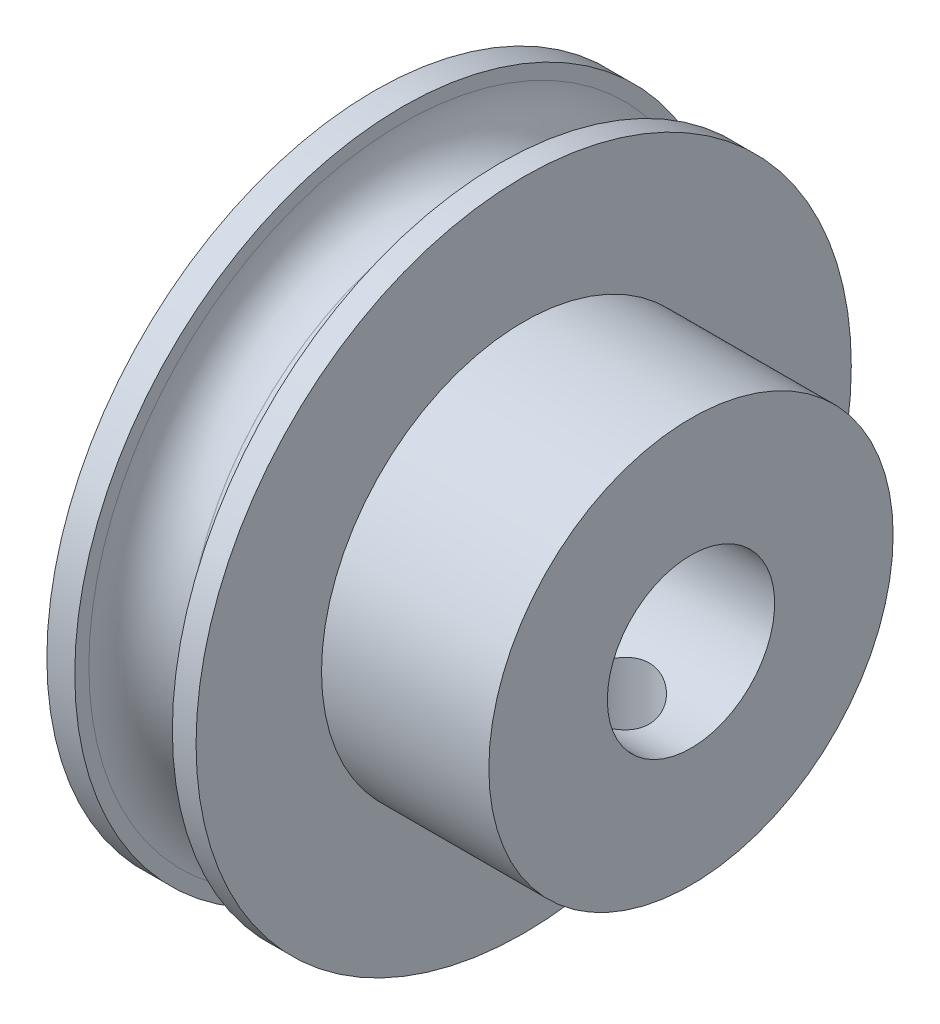
ISO-10303-21;
HEADER;
FILE_DESCRIPTION(('STEP AP214'),'2;1');
FILE_NAME('part.step','',(''),(''),'','','');
FILE_SCHEMA(('AUTOMOTIVE_DESIGN { 1 0 10303 214 1 1 1 1 }'));
ENDSEC;
DATA;
#1=APPLICATION_CONTEXT('core data for automotive mechanical design processes');
#2=APPLICATION_PROTOCOL_DEFINITION('international standard','automotive_design',2000,#1);
#3=PRODUCT_CONTEXT('',#1,'mechanical');
#4=PRODUCT('Part','Part','',(#3));
#5=PRODUCT_RELATED_PRODUCT_CATEGORY('part','',(#4));
#6=PRODUCT_DEFINITION_FORMATION('','',#4);
#7=PRODUCT_DEFINITION_CONTEXT('part definition',#1,'design');
#8=PRODUCT_DEFINITION('design','',#6,#7);
#9=PRODUCT_DEFINITION_SHAPE('','',#8);
#10=(LENGTH_UNIT() NAMED_UNIT(*) SI_UNIT(.MILLI.,.METRE.));
#11=(NAMED_UNIT(*) PLANE_ANGLE_UNIT() SI_UNIT($,.RADIAN.));
#12=(NAMED_UNIT(*) SI_UNIT($,.STERADIAN.) SOLID_ANGLE_UNIT());
#13=UNCERTAINTY_MEASURE_WITH_UNIT(LENGTH_MEASURE(1.E-05),#10,'distance_accuracy_value','');
#14=(GEOMETRIC_REPRESENTATION_CONTEXT(3) GLOBAL_UNCERTAINTY_ASSIGNED_CONTEXT((#13)) GLOBAL_UNIT_ASSIGNED_CONTEXT((#10,
#11,#12)) REPRESENTATION_CONTEXT('',''));
#15=CARTESIAN_POINT('',(0.,0.,0.));
#16=DIRECTION('',(0.,0.,1.));
#17=DIRECTION('',(1.,0.,0.));
#18=AXIS2_PLACEMENT_3D('',#15,#16,#17);
#19=CARTESIAN_POINT('',(0.,23.5,0.));
#20=DIRECTION('',(1.,0.,0.));
#21=DIRECTION('',(0.,0.,-1.));
#22=AXIS2_PLACEMENT_3D('',#19,#20,#21);
#23=PLANE('',#22);
#24=CARTESIAN_POINT('',(0.,0.,0.));
#25=DIRECTION('',(-1.,0.,0.));
#26=DIRECTION('',(0.,0.,1.));
#27=AXIS2_PLACEMENT_3D('',#24,#25,#26);
#28=CIRCLE('',#27,6.);
#29=CARTESIAN_POINT('',(0.,0.,6.));
#30=VERTEX_POINT('',#29);
#31=EDGE_CURVE('E88',#30,#30,#28,.T.);
#32=ORIENTED_EDGE('',*,*,#31,.F.);
#33=EDGE_LOOP('',(#32));
#34=FACE_BOUND('',#33,.T.);
#35=CARTESIAN_POINT('',(0.,0.,0.));
#36=DIRECTION('',(-1.,0.,0.));
#37=DIRECTION('',(0.,0.,1.));
#38=AXIS2_PLACEMENT_3D('',#35,#36,#37);
#39=CIRCLE('',#38,23.5);
#40=CARTESIAN_POINT('',(0.,0.,23.5));
#41=VERTEX_POINT('',#40);
#42=EDGE_CURVE('E12',#41,#41,#39,.T.);
#43=ORIENTED_EDGE('',*,*,#42,.T.);
#44=EDGE_LOOP('',(#43));
#45=FACE_BOUND('',#44,.T.);
#46=ADVANCED_FACE('F48',(#34,#45),#23,.F.);
#47=CARTESIAN_POINT('',(0.,0.,0.));
#48=DIRECTION('',(-1.,0.,0.));
#49=DIRECTION('',(0.,0.,1.));
#50=AXIS2_PLACEMENT_3D('',#47,#48,#49);
#51=CYLINDRICAL_SURFACE('',#50,23.5);
#52=ORIENTED_EDGE('',*,*,#42,.F.);
#53=EDGE_LOOP('',(#52));
#54=FACE_BOUND('',#53,.T.);
#55=CARTESIAN_POINT('',(2.,0.,0.));
#56=DIRECTION('',(-1.,0.,0.));
#57=DIRECTION('',(0.,0.,1.));
#58=AXIS2_PLACEMENT_3D('',#55,#56,#57);
#59=CIRCLE('',#58,23.5);
#60=CARTESIAN_POINT('',(2.,0.,23.5));
#61=VERTEX_POINT('',#60);
#62=EDGE_CURVE('E54',#61,#61,#59,.T.);
#63=ORIENTED_EDGE('',*,*,#62,.T.);
#64=EDGE_LOOP('',(#63));
#65=FACE_BOUND('',#64,.T.);
#66=ADVANCED_FACE('F148',(#54,#65),#51,.T.);
#67=CARTESIAN_POINT('',(2.,22.49,0.));
#68=DIRECTION('',(-1.,0.,0.));
#69=DIRECTION('',(0.,0.,1.));
#70=AXIS2_PLACEMENT_3D('',#67,#68,#69);
#71=PLANE('',#70);
#72=ORIENTED_EDGE('',*,*,#62,.F.);
#73=EDGE_LOOP('',(#72));
#74=FACE_BOUND('',#73,.T.);
#75=CARTESIAN_POINT('',(2.,0.,0.));
#76=DIRECTION('',(-1.,0.,0.));
#77=DIRECTION('',(0.,0.,1.));
#78=AXIS2_PLACEMENT_3D('',#75,#76,#77);
#79=CIRCLE('',#78,22.49);
#80=CARTESIAN_POINT('',(2.,0.,22.49));
#81=VERTEX_POINT('',#80);
#82=EDGE_CURVE('E58',#81,#81,#79,.T.);
#83=ORIENTED_EDGE('',*,*,#82,.T.);
#84=EDGE_LOOP('',(#83));
#85=FACE_BOUND('',#84,.T.);
#86=ADVANCED_FACE('F145',(#74,#85),#71,.F.);
#87=CARTESIAN_POINT('',(5.48999999999999,0.,0.));
#88=DIRECTION('',(-1.,0.,0.));
#89=DIRECTION('',(0.,0.,1.));
#90=AXIS2_PLACEMENT_3D('',#87,#88,#89);
#91=TOROIDAL_SURFACE('',#90,22.49,3.49);
#92=ORIENTED_EDGE('',*,*,#82,.F.);
#93=EDGE_LOOP('',(#92));
#94=FACE_BOUND('',#93,.T.);
#95=CARTESIAN_POINT('',(5.48999999999999,0.,0.));
#96=DIRECTION('',(-1.,0.,0.));
#97=DIRECTION('',(0.,0.,1.));
#98=AXIS2_PLACEMENT_3D('',#95,#96,#97);
#99=CIRCLE('',#98,19.);
#100=CARTESIAN_POINT('',(5.48999999999999,0.,19.));
#101=VERTEX_POINT('',#100);
#102=EDGE_CURVE('E62',#101,#101,#99,.T.);
#103=ORIENTED_EDGE('',*,*,#102,.T.);
#104=EDGE_LOOP('',(#103));
#105=FACE_BOUND('',#104,.T.);
#106=ADVANCED_FACE('F141',(#94,#105),#91,.F.);
#107=CARTESIAN_POINT('',(0.,0.,0.));
#108=DIRECTION('',(-1.,0.,0.));
#109=DIRECTION('',(0.,0.,1.));
#110=AXIS2_PLACEMENT_3D('',#107,#108,#109);
#111=CYLINDRICAL_SURFACE('',#110,19.);
#112=ORIENTED_EDGE('',*,*,#102,.F.);
#113=EDGE_LOOP('',(#112));
#114=FACE_BOUND('',#113,.T.);
#115=CARTESIAN_POINT('',(5.51000000000001,0.,0.));
#116=DIRECTION('',(-1.,0.,0.));
#117=DIRECTION('',(0.,0.,1.));
#118=AXIS2_PLACEMENT_3D('',#115,#116,#117);
#119=CIRCLE('',#118,19.);
#120=CARTESIAN_POINT('',(5.51000000000001,0.,19.));
#121=VERTEX_POINT('',#120);
#122=EDGE_CURVE('E67',#121,#121,#119,.T.);
#123=ORIENTED_EDGE('',*,*,#122,.T.);
#124=EDGE_LOOP('',(#123));
#125=FACE_BOUND('',#124,.T.);
#126=ADVANCED_FACE('F137',(#114,#125),#111,.T.);
#127=CARTESIAN_POINT('',(5.51000000000001,0.,0.));
#128=DIRECTION('',(-1.,0.,0.));
#129=DIRECTION('',(0.,0.,1.));
#130=AXIS2_PLACEMENT_3D('',#127,#128,#129);
#131=TOROIDAL_SURFACE('',#130,22.49,3.49);
#132=ORIENTED_EDGE('',*,*,#122,.F.);
#133=EDGE_LOOP('',(#132));
#134=FACE_BOUND('',#133,.T.);
#135=CARTESIAN_POINT('',(9.00000000000001,0.,0.));
#136=DIRECTION('',(-1.,0.,0.));
#137=DIRECTION('',(0.,0.,1.));
#138=AXIS2_PLACEMENT_3D('',#135,#136,#137);
#139=CIRCLE('',#138,22.49);
#140=CARTESIAN_POINT('',(9.00000000000001,0.,22.49));
#141=VERTEX_POINT('',#140);
#142=EDGE_CURVE('E70',#141,#141,#139,.T.);
#143=ORIENTED_EDGE('',*,*,#142,.T.);
#144=EDGE_LOOP('',(#143));
#145=FACE_BOUND('',#144,.T.);
#146=ADVANCED_FACE('F133',(#134,#145),#131,.F.);
#147=CARTESIAN_POINT('',(9.00000000000001,23.5,0.));
#148=DIRECTION('',(1.,0.,0.));
#149=DIRECTION('',(0.,0.,-1.));
#150=AXIS2_PLACEMENT_3D('',#147,#148,#149);
#151=PLANE('',#150);
#152=ORIENTED_EDGE('',*,*,#142,.F.);
#153=EDGE_LOOP('',(#152));
#154=FACE_BOUND('',#153,.T.);
#155=CARTESIAN_POINT('',(9.00000000000001,0.,0.));
#156=DIRECTION('',(-1.,0.,0.));
#157=DIRECTION('',(0.,0.,1.));
#158=AXIS2_PLACEMENT_3D('',#155,#156,#157);
#159=CIRCLE('',#158,23.5);
#160=CARTESIAN_POINT('',(9.00000000000001,0.,23.5));
#161=VERTEX_POINT('',#160);
#162=EDGE_CURVE('E73',#161,#161,#159,.T.);
#163=ORIENTED_EDGE('',*,*,#162,.T.);
#164=EDGE_LOOP('',(#163));
#165=FACE_BOUND('',#164,.T.);
#166=ADVANCED_FACE('F129',(#154,#165),#151,.F.);
#167=CARTESIAN_POINT('',(0.,0.,0.));
#168=DIRECTION('',(-1.,0.,0.));
#169=DIRECTION('',(0.,0.,1.));
#170=AXIS2_PLACEMENT_3D('',#167,#168,#169);
#171=CYLINDRICAL_SURFACE('',#170,23.5);
#172=ORIENTED_EDGE('',*,*,#162,.F.);
#173=EDGE_LOOP('',(#172));
#174=FACE_BOUND('',#173,.T.);
#175=CARTESIAN_POINT('',(10.7,0.,0.));
#176=DIRECTION('',(-1.,0.,0.));
#177=DIRECTION('',(0.,0.,1.));
#178=AXIS2_PLACEMENT_3D('',#175,#176,#177);
#179=CIRCLE('',#178,23.5);
#180=CARTESIAN_POINT('',(10.7,0.,23.5));
#181=VERTEX_POINT('',#180);
#182=EDGE_CURVE('E76',#181,#181,#179,.T.);
#183=ORIENTED_EDGE('',*,*,#182,.T.);
#184=EDGE_LOOP('',(#183));
#185=FACE_BOUND('',#184,.T.);
#186=ADVANCED_FACE('F125',(#174,#185),#171,.T.);
#187=CARTESIAN_POINT('',(10.7,14.5,0.));
#188=DIRECTION('',(-1.,0.,0.));
#189=DIRECTION('',(0.,0.,1.));
#190=AXIS2_PLACEMENT_3D('',#187,#188,#189);
#191=PLANE('',#190);
#192=ORIENTED_EDGE('',*,*,#182,.F.);
#193=EDGE_LOOP('',(#192));
#194=FACE_BOUND('',#193,.T.);
#195=CARTESIAN_POINT('',(10.7,0.,0.));
#196=DIRECTION('',(-1.,0.,0.));
#197=DIRECTION('',(0.,0.,1.));
#198=AXIS2_PLACEMENT_3D('',#195,#196,#197);
#199=CIRCLE('',#198,14.5);
#200=CARTESIAN_POINT('',(10.7,0.,14.5));
#201=VERTEX_POINT('',#200);
#202=EDGE_CURVE('E79',#201,#201,#199,.T.);
#203=ORIENTED_EDGE('',*,*,#202,.T.);
#204=EDGE_LOOP('',(#203));
#205=FACE_BOUND('',#204,.T.);
#206=ADVANCED_FACE('F121',(#194,#205),#191,.F.);
#207=CARTESIAN_POINT('',(0.,0.,0.));
#208=DIRECTION('',(-1.,0.,0.));
#209=DIRECTION('',(0.,0.,1.));
#210=AXIS2_PLACEMENT_3D('',#207,#208,#209);
#211=CYLINDRICAL_SURFACE('',#210,14.5);
#212=CARTESIAN_POINT('',(16.6999999999999,-14.1862609591111,3.00000000000002));
#213=CARTESIAN_POINT('',(16.5334352226009,-14.1862643026301,2.99999398799856));
#214=CARTESIAN_POINT('',(16.3667959917559,-14.1892263985239,2.98608094905852));
#215=CARTESIAN_POINT('',(16.0382405208553,-14.2007357754825,2.93084795980272));
#216=CARTESIAN_POINT('',(15.8763280298802,-14.2092873705981,2.88950683975346));
#217=CARTESIAN_POINT('',(15.5620266634526,-14.2309667125939,2.7807619130138));
#218=CARTESIAN_POINT('',(15.4096281540622,-14.2440897387716,2.71338498446933));
#219=CARTESIAN_POINT('',(15.1182995425809,-14.2734276728606,2.5545558545719));
#220=CARTESIAN_POINT('',(14.9793688603185,-14.2896424474952,2.46310469092784));
#221=CARTESIAN_POINT('',(14.7168128313861,-14.3236108843709,2.25724857357097));
#222=CARTESIAN_POINT('',(14.5934208529133,-14.341382448714,2.14254887909173));
#223=CARTESIAN_POINT('',(14.3674845526385,-14.3763047984443,1.89408823389156));
#224=CARTESIAN_POINT('',(14.2649417478607,-14.3934555385847,1.76032589734147));
#225=CARTESIAN_POINT('',(14.08270270999,-14.4253975844857,1.47598463214487));
#226=CARTESIAN_POINT('',(14.003229217105,-14.4401653128346,1.32526006959417));
#227=CARTESIAN_POINT('',(13.8708234079518,-14.4654759082509,1.01223979370051));
#228=CARTESIAN_POINT('',(13.8178884311736,-14.4760191988007,0.849945242123294));
#229=CARTESIAN_POINT('',(13.7407914643541,-14.491566488901,0.520815560786252));
#230=CARTESIAN_POINT('',(13.7162350683281,-14.4966463485531,0.354076462053236));
#231=CARTESIAN_POINT('',(13.6953608627741,-14.5009567126313,0.018772983182074));
#232=CARTESIAN_POINT('',(13.6990401494344,-14.5001878185545,-0.149791207479696));
#233=CARTESIAN_POINT('',(13.7342356583406,-14.4929458021349,-0.481246650467434));
#234=CARTESIAN_POINT('',(13.7653269440715,-14.486559759473,-0.64418520512637));
#235=CARTESIAN_POINT('',(13.8537887504012,-14.4688995419812,-0.962481109466366));
#236=CARTESIAN_POINT('',(13.911160373468,-14.4576251620853,-1.11783814079771));
#237=CARTESIAN_POINT('',(14.0509415392092,-14.4313127844275,-1.41776152025408));
#238=CARTESIAN_POINT('',(14.1335156175612,-14.4162501722432,-1.56224893772927));
#239=CARTESIAN_POINT('',(14.321235641581,-14.3840186654062,-1.83547307750531));
#240=CARTESIAN_POINT('',(14.4263843570662,-14.3668495124003,-1.96420786397583));
#241=CARTESIAN_POINT('',(14.6585937723357,-14.3319206767823,-2.20479629303862));
#242=CARTESIAN_POINT('',(14.7860263894825,-14.3141559521464,-2.31629052797433));
#243=CARTESIAN_POINT('',(15.0579615566563,-14.2803404019263,-2.51638763974967));
#244=CARTESIAN_POINT('',(15.2024644763987,-14.2642896134775,-2.60499002065578));
#245=CARTESIAN_POINT('',(15.5049776701413,-14.2357080677622,-2.75692496820571));
#246=CARTESIAN_POINT('',(15.6630197781921,-14.22318592087,-2.8201958780157));
#247=CARTESIAN_POINT('',(15.9878116466705,-14.2032030648056,-2.91917772006692));
#248=CARTESIAN_POINT('',(16.1545601814461,-14.1957416452647,-2.95489252042602));
#249=CARTESIAN_POINT('',(16.488764524744,-14.1868683102837,-2.99720392356288));
#250=CARTESIAN_POINT('',(16.6561516323811,-14.1853482594883,-3.00432108306759));
#251=CARTESIAN_POINT('',(16.9897209802198,-14.1882389905629,-2.99063902178304));
#252=CARTESIAN_POINT('',(17.1559032932486,-14.192649410892,-2.96984150276327));
#253=CARTESIAN_POINT('',(17.4805736073883,-14.2068025702359,-2.9013702749506));
#254=CARTESIAN_POINT('',(17.6391235680959,-14.2164894873287,-2.85397776800803));
#255=CARTESIAN_POINT('',(17.9460327199565,-14.2400547166444,-2.73396389219741));
#256=CARTESIAN_POINT('',(18.0943910206156,-14.2539333945513,-2.66134032212036));
#257=CARTESIAN_POINT('',(18.3789743433828,-14.2845593839541,-2.49175880139083));
#258=CARTESIAN_POINT('',(18.515002267943,-14.3013438544556,-2.39447693555543));
#259=CARTESIAN_POINT('',(18.7689930568286,-14.3357897256626,-2.17876921115707));
#260=CARTESIAN_POINT('',(18.8869539221947,-14.3534512231175,-2.06034101607613));
#261=CARTESIAN_POINT('',(19.1034525552361,-14.3880140779819,-1.80335873615814));
#262=CARTESIAN_POINT('',(19.2016372941746,-14.4048980598064,-1.66450451525739));
#263=CARTESIAN_POINT('',(19.3732852185074,-14.4356952597221,-1.37196991871046));
#264=CARTESIAN_POINT('',(19.4467494871228,-14.449608607973,-1.21829019307982));
#265=CARTESIAN_POINT('',(19.5663646933772,-14.4728230136816,-0.901367865002366));
#266=CARTESIAN_POINT('',(19.6126774569243,-14.4821513433367,-0.738188427277215));
#267=CARTESIAN_POINT('',(19.6771852778369,-14.495261982232,-0.406152853898614));
#268=CARTESIAN_POINT('',(19.6953839714387,-14.499045008691,-0.237297455253374));
#269=CARTESIAN_POINT('',(19.7029980707005,-14.5006202814205,0.0979323721364677));
#270=CARTESIAN_POINT('',(19.6929428928976,-14.4985227189023,0.264294483248215));
#271=CARTESIAN_POINT('',(19.6455090878326,-14.4888057528339,0.592903319238593));
#272=CARTESIAN_POINT('',(19.608130854829,-14.4811864289602,0.755150103464423));
#273=CARTESIAN_POINT('',(19.5073540400766,-14.4612869876687,1.07056416090537));
#274=CARTESIAN_POINT('',(19.444023213309,-14.4490190128171,1.22375389674059));
#275=CARTESIAN_POINT('',(19.2932080267679,-14.4211392361672,1.51740693237083));
#276=CARTESIAN_POINT('',(19.2057215974142,-14.4055271478809,1.6578691403388));
#277=CARTESIAN_POINT('',(19.0073140711375,-14.3723343156892,1.92468520748161));
#278=CARTESIAN_POINT('',(18.8960164887253,-14.3547243792791,2.05075550572883));
#279=CARTESIAN_POINT('',(18.6539145845169,-14.3196880458798,2.28261178641999));
#280=CARTESIAN_POINT('',(18.5231056239121,-14.3022616935951,2.38839293143184));
#281=CARTESIAN_POINT('',(18.2438589218852,-14.2693404352253,2.57784847106824));
#282=CARTESIAN_POINT('',(18.0952330890979,-14.2538704709883,2.66125017315497));
#283=CARTESIAN_POINT('',(17.785794080581,-14.2269212256267,2.80176220612172));
#284=CARTESIAN_POINT('',(17.6249918449933,-14.2154384127884,2.85889581919822));
#285=CARTESIAN_POINT('',(17.336578940594,-14.1999956220398,2.93448362771769));
#286=CARTESIAN_POINT('',(17.2105857447765,-14.1948778427569,2.95900719576448));
#287=CARTESIAN_POINT('',(16.9564096833464,-14.1880092903135,2.99176737678892));
#288=CARTESIAN_POINT('',(16.8282269037697,-14.1862583851631,3.00000462823141));
#289=CARTESIAN_POINT('',(16.6999999999999,-14.1862609591111,3.00000000000002));
#290=B_SPLINE_CURVE_WITH_KNOTS('',3,(#212,#213,#214,#215,#216,#217,#218,#219,#220,#221,#222,
#223,#224,#225,#226,#227,#228,#229,#230,#231,#232,#233,#234,#235,#236,#237,#238,#239,#240,#241,
#242,#243,#244,#245,#246,#247,#248,#249,#250,#251,#252,#253,#254,#255,#256,#257,#258,#259,#260,
#261,#262,#263,#264,#265,#266,#267,#268,#269,#270,#271,#272,#273,#274,#275,#276,#277,#278,#279,
#280,#281,#282,#283,#284,#285,#286,#287,#288,#289),.UNSPECIFIED.,.T.,.F.,(4,2,2,2,2,2,2,2,2,2,2,
2,2,2,2,2,2,2,2,2,2,2,2,2,2,2,2,2,2,2,2,2,2,2,2,2,2,2,4),(0.,0.499224678917989,
0.998835121871928,1.49793116249299,1.99700569332906,2.50285505715759,3.00874121435095,
3.51936067991401,4.02992894517676,4.53331259183254,5.03664447024517,5.5323083248532,
6.02799297461136,6.52698557998395,7.02603944477284,7.53439600241308,8.04276357226419,
8.55236109475367,9.06188707078283,9.56209505600532,10.0622725483089,10.5572584512936,
11.0522875486981,11.5541908713157,12.0561496850129,12.5664001354305,13.0766282243762,
13.5837835426802,14.0908732607002,14.5885249143193,15.0861693872105,15.5825228434441,
16.0789188389733,16.5838356218976,17.0888726401352,17.5998096162919,18.1102928564771,
18.4946270808142,18.8789462379777),.UNSPECIFIED.);
#291=CARTESIAN_POINT('',(16.6999999999999,-14.1862609591111,3.00000000000002));
#292=VERTEX_POINT('',#291);
#293=EDGE_CURVE('E91',#292,#292,#290,.T.);
#294=ORIENTED_EDGE('',*,*,#293,.F.);
#295=EDGE_LOOP('',(#294));
#296=FACE_BOUND('',#295,.T.);
#297=ORIENTED_EDGE('',*,*,#202,.F.);
#298=EDGE_LOOP('',(#297));
#299=FACE_BOUND('',#298,.T.);
#300=CARTESIAN_POINT('',(22.6999999999999,0.,0.));
#301=DIRECTION('',(-1.,0.,0.));
#302=DIRECTION('',(0.,0.,1.));
#303=AXIS2_PLACEMENT_3D('',#300,#301,#302);
#304=CIRCLE('',#303,14.5);
#305=CARTESIAN_POINT('',(22.6999999999999,0.,14.5));
#306=VERTEX_POINT('',#305);
#307=EDGE_CURVE('E82',#306,#306,#304,.T.);
#308=ORIENTED_EDGE('',*,*,#307,.T.);
#309=EDGE_LOOP('',(#308));
#310=FACE_BOUND('',#309,.T.);
#311=ADVANCED_FACE('F117',(#296,#299,#310),#211,.T.);
#312=CARTESIAN_POINT('',(22.6999999999999,5.99999999999995,0.));
#313=DIRECTION('',(-1.,0.,0.));
#314=DIRECTION('',(0.,0.,1.));
#315=AXIS2_PLACEMENT_3D('',#312,#313,#314);
#316=PLANE('',#315);
#317=ORIENTED_EDGE('',*,*,#307,.F.);
#318=EDGE_LOOP('',(#317));
#319=FACE_BOUND('',#318,.T.);
#320=CARTESIAN_POINT('',(22.6999999999999,0.,0.));
#321=DIRECTION('',(-1.,0.,0.));
#322=DIRECTION('',(0.,0.,1.));
#323=AXIS2_PLACEMENT_3D('',#320,#321,#322);
#324=CIRCLE('',#323,6.);
#325=CARTESIAN_POINT('',(22.6999999999999,0.,6.));
#326=VERTEX_POINT('',#325);
#327=EDGE_CURVE('E85',#326,#326,#324,.T.);
#328=ORIENTED_EDGE('',*,*,#327,.T.);
#329=EDGE_LOOP('',(#328));
#330=FACE_BOUND('',#329,.T.);
#331=ADVANCED_FACE('F113',(#319,#330),#316,.F.);
#332=CARTESIAN_POINT('',(0.,0.,0.));
#333=DIRECTION('',(-1.,0.,0.));
#334=DIRECTION('',(0.,0.,1.));
#335=AXIS2_PLACEMENT_3D('',#332,#333,#334);
#336=CYLINDRICAL_SURFACE('',#335,6.);
#337=CARTESIAN_POINT('',(16.6999999999999,-5.19615242270666,2.99999999999999));
#338=CARTESIAN_POINT('',(16.778200233259,-5.19615338151417,2.99999910875736));
#339=CARTESIAN_POINT('',(16.8564099984645,-5.19792581191127,2.99693611207794));
#340=CARTESIAN_POINT('',(17.012208075142,-5.20493931657122,2.98473565374509));
#341=CARTESIAN_POINT('',(17.0897960802685,-5.21018200566082,2.97559536411629));
#342=CARTESIAN_POINT('',(17.3209440142464,-5.23088200558208,2.93916912258039));
#343=CARTESIAN_POINT('',(17.4727509105332,-5.25131076607217,2.90287805814897));
#344=CARTESIAN_POINT('',(17.7663916335235,-5.30247746927542,2.80829998089518));
#345=CARTESIAN_POINT('',(17.9082738017509,-5.3331605157792,2.75012989346614));
#346=CARTESIAN_POINT('',(18.1802627617008,-5.40128072966972,2.61380253964661));
#347=CARTESIAN_POINT('',(18.3103689158749,-5.43871826241345,2.53564419197536));
#348=CARTESIAN_POINT('',(18.5669201461477,-5.51990583559836,2.35399963256534));
#349=CARTESIAN_POINT('',(18.6921782021559,-5.56392184571631,2.24895611137359));
#350=CARTESIAN_POINT('',(18.9242243696895,-5.65115954702502,2.01976141989958));
#351=CARTESIAN_POINT('',(19.0310032682567,-5.69438083245622,1.89560077655244));
#352=CARTESIAN_POINT('',(19.2301016877324,-5.77864428988888,1.62146869109161));
#353=CARTESIAN_POINT('',(19.3209613659272,-5.81934318752246,1.4703215671899));
#354=CARTESIAN_POINT('',(19.475422497428,-5.89052268800542,1.15247107964635));
#355=CARTESIAN_POINT('',(19.5390411532466,-5.92100973690813,0.985777614653078));
#356=CARTESIAN_POINT('',(19.6325139979892,-5.96641383603059,0.654134831556285));
#357=CARTESIAN_POINT('',(19.664448579648,-5.98228440595572,0.489905370480156));
#358=CARTESIAN_POINT('',(19.700498355444,-6.00022751605264,0.157711887079211));
#359=CARTESIAN_POINT('',(19.7046303821322,-6.00230840492444,-0.0102498138110559));
#360=CARTESIAN_POINT('',(19.6857599673652,-5.99288945622745,-0.329497576667923));
#361=CARTESIAN_POINT('',(19.6650859119219,-5.98255487247968,-0.48096360970458));
#362=CARTESIAN_POINT('',(19.6013575098035,-5.95122736207788,-0.777941303579832));
#363=CARTESIAN_POINT('',(19.5583014884221,-5.93023363786805,-0.923452517976635));
#364=CARTESIAN_POINT('',(19.4507521442304,-5.8791474825337,-1.20692822064062));
#365=CARTESIAN_POINT('',(19.3859704687993,-5.84893318545181,-1.34476044302999));
#366=CARTESIAN_POINT('',(19.237210343292,-5.78212944004645,-1.60793023199366));
#367=CARTESIAN_POINT('',(19.1532250204904,-5.7455377104437,-1.73326330217193));
#368=CARTESIAN_POINT('',(18.9593115260605,-5.66533158492097,-1.98052168794679));
#369=CARTESIAN_POINT('',(18.8476814893583,-5.62138031742824,-2.10100497271933));
#370=CARTESIAN_POINT('',(18.6062402580911,-5.53363118085846,-2.32231036115796));
#371=CARTESIAN_POINT('',(18.4764152061043,-5.48983345502616,-2.42311733790257));
#372=CARTESIAN_POINT('',(18.1920178566592,-5.40432084665527,-2.60852695463449));
#373=CARTESIAN_POINT('',(18.036397564354,-5.36291485750668,-2.69169402852798));
#374=CARTESIAN_POINT('',(17.7924369453882,-5.30915194408667,-2.79542837524196));
#375=CARTESIAN_POINT('',(17.7093436895952,-5.2926194649543,-2.82650797341999));
#376=CARTESIAN_POINT('',(17.5401913969656,-5.26298473463271,-2.88131297532031));
#377=CARTESIAN_POINT('',(17.4541342255252,-5.24988036897859,-2.90504291399183));
#378=CARTESIAN_POINT('',(17.286628379776,-5.22855455988397,-2.94323927983802));
#379=CARTESIAN_POINT('',(17.2053505743622,-5.22002982263215,-2.95828810706485));
#380=CARTESIAN_POINT('',(17.0415647613341,-5.2067273715729,-2.98163903200841));
#381=CARTESIAN_POINT('',(16.9590574162517,-5.20194770920409,-2.98994463830254));
#382=CARTESIAN_POINT('',(16.7935289931973,-5.19633662863608,-2.99968663811345));
#383=CARTESIAN_POINT('',(16.7105081180563,-5.19550374026211,-3.00112558946314));
#384=CARTESIAN_POINT('',(16.5447135392354,-5.19780953199967,-2.99712742537402));
#385=CARTESIAN_POINT('',(16.4619398192495,-5.20094794403251,-2.99169077406594));
#386=CARTESIAN_POINT('',(16.2331408639573,-5.2150449301025,-2.96710135231209));
#387=CARTESIAN_POINT('',(16.0880891897367,-5.23019160660497,-2.94056163100181));
#388=CARTESIAN_POINT('',(15.8048690892031,-5.27081666384495,-2.86709067362232));
#389=CARTESIAN_POINT('',(15.6667029081698,-5.29629839028765,-2.82015283383764));
#390=CARTESIAN_POINT('',(15.3937738960801,-5.35608780273032,-2.70494224478443));
#391=CARTESIAN_POINT('',(15.2594650720959,-5.39074960412729,-2.63578205088438));
#392=CARTESIAN_POINT('',(15.0035900616339,-5.46468327792415,-2.47886133231341));
#393=CARTESIAN_POINT('',(14.8820304691885,-5.50395751387987,-2.39109125263821));
#394=CARTESIAN_POINT('',(14.6390643733681,-5.58864005140304,-2.18651145695799));
#395=CARTESIAN_POINT('',(14.5196087290999,-5.63419752084738,-2.06743580499401));
#396=CARTESIAN_POINT('',(14.3017631047051,-5.72202702310922,-1.8102134981498));
#397=CARTESIAN_POINT('',(14.2033802403245,-5.76429794308226,-1.67206042712514));
#398=CARTESIAN_POINT('',(14.0282788724263,-5.84224085806643,-1.37560608443379));
#399=CARTESIAN_POINT('',(13.9522006581168,-5.87770925226882,-1.21686929217557));
#400=CARTESIAN_POINT('',(13.8285862756894,-5.93650064667293,-0.886567094469569));
#401=CARTESIAN_POINT('',(13.7810250451581,-5.95983430919534,-0.715013103124009));
#402=CARTESIAN_POINT('',(13.7198943081509,-5.99002524645181,-0.380939047947187));
#403=CARTESIAN_POINT('',(13.7036063644392,-5.998197839307,-0.219034335650385));
#404=CARTESIAN_POINT('',(13.6974702115664,-6.00126390919339,0.105377961951201));
#405=CARTESIAN_POINT('',(13.7076127468168,-5.99616203476061,0.267885316317462));
#406=CARTESIAN_POINT('',(13.7522491901335,-5.97401907190642,0.577613962536147));
#407=CARTESIAN_POINT('',(13.7850944376656,-5.95778686442444,0.725136901247736));
#408=CARTESIAN_POINT('',(13.871981108032,-5.91576278551445,1.01233790874441));
#409=CARTESIAN_POINT('',(13.9260255705425,-5.88996954319459,1.15201484923626));
#410=CARTESIAN_POINT('',(14.0561807286888,-5.82977801711603,1.42627001605162));
#411=CARTESIAN_POINT('',(14.1331363415363,-5.79505887623288,1.56037465678413));
#412=CARTESIAN_POINT('',(14.3058754214135,-5.72064363382008,1.81432469711305));
#413=CARTESIAN_POINT('',(14.4016675359887,-5.6809452494399,1.93416350676912));
#414=CARTESIAN_POINT('',(14.6203847224835,-5.5958597881944,2.1687388408778));
#415=CARTESIAN_POINT('',(14.7450613207736,-5.55029975504518,2.28178066887875));
#416=CARTESIAN_POINT('',(15.0123783280701,-5.46188649509676,2.4860022578303));
#417=CARTESIAN_POINT('',(15.155034461031,-5.4190356875087,2.57716267726708));
#418=CARTESIAN_POINT('',(15.3825317933017,-5.36004774906987,2.69665559342491));
#419=CARTESIAN_POINT('',(15.4619758009824,-5.34101219148463,2.73405408762356));
#420=CARTESIAN_POINT('',(15.6243532830087,-5.30572783063718,2.80191257626506));
#421=CARTESIAN_POINT('',(15.707284933748,-5.28947759301443,2.83237614466584));
#422=CARTESIAN_POINT('',(15.8758447323697,-5.26045215868185,2.88592624586959));
#423=CARTESIAN_POINT('',(15.9614653072413,-5.2476680350909,2.90903175649395));
#424=CARTESIAN_POINT('',(16.1348552553142,-5.22608869625113,2.9476242805163));
#425=CARTESIAN_POINT('',(16.2226230809206,-5.21729069243667,2.96311662049619));
#426=CARTESIAN_POINT('',(16.3753988177599,-5.20588528016135,2.9830938122572));
#427=CARTESIAN_POINT('',(16.4400948089069,-5.20224442588138,2.9894274622838));
#428=CARTESIAN_POINT('',(16.5698583167996,-5.19737751744686,2.99788106792142));
#429=CARTESIAN_POINT('',(16.6349258581076,-5.19615162483722,3.00000074164546));
#430=CARTESIAN_POINT('',(16.6999999999999,-5.19615242270666,2.99999999999999));
#431=B_SPLINE_CURVE_WITH_KNOTS('',3,(#337,#338,#339,#340,#341,#342,#343,#344,#345,#346,#347,
#348,#349,#350,#351,#352,#353,#354,#355,#356,#357,#358,#359,#360,#361,#362,#363,#364,#365,#366,
#367,#368,#369,#370,#371,#372,#373,#374,#375,#376,#377,#378,#379,#380,#381,#382,#383,#384,#385,
#386,#387,#388,#389,#390,#391,#392,#393,#394,#395,#396,#397,#398,#399,#400,#401,#402,#403,#404,
#405,#406,#407,#408,#409,#410,#411,#412,#413,#414,#415,#416,#417,#418,#419,#420,#421,#422,#423,
#424,#425,#426,#427,#428,#429,#430),.UNSPECIFIED.,.T.,.F.,(4,2,2,2,2,2,2,2,2,2,2,2,2,2,2,2,2,2,
2,2,2,2,2,2,2,2,2,2,2,2,2,2,2,2,2,2,2,2,2,2,2,2,2,2,2,2,4),(0.,0.234529430733914,
0.469168072604301,0.938850383294604,1.40605749261247,1.87328988121659,2.37905864237587,
2.88507883741233,3.42520847204407,3.96499651379788,4.46637625391921,4.96745241546235,
5.42495462941729,5.88249108040479,6.34635774681553,6.81039068538929,7.31828744858786,
7.82657315225872,8.36713695676457,8.63752916119811,8.90775419202324,9.15669600787589,
9.40550821320569,9.65422772860781,9.90293045534215,10.3454331624117,10.7880792327728,
11.2512265518736,11.7146122462924,12.2364099671094,12.7583836090371,13.29413310208,
13.8294110539542,14.3155757713756,14.8015702635102,15.2555404058358,15.7095756650514,
16.1830301812752,16.6567025627126,17.177514915193,17.6987859450456,17.968011589323,
18.2370981707631,18.5054849980179,18.7736837791728,18.9688338446807,19.1639969639894),.UNSPECIFIED.);
#432=CARTESIAN_POINT('',(16.6999999999999,-5.19615242270666,2.99999999999999));
#433=VERTEX_POINT('',#432);
#434=EDGE_CURVE('E98',#433,#433,#431,.T.);
#435=ORIENTED_EDGE('',*,*,#434,.F.);
#436=EDGE_LOOP('',(#435));
#437=FACE_BOUND('',#436,.T.);
#438=ORIENTED_EDGE('',*,*,#327,.F.);
#439=EDGE_LOOP('',(#438));
#440=FACE_BOUND('',#439,.T.);
#441=ORIENTED_EDGE('',*,*,#31,.T.);
#442=EDGE_LOOP('',(#441));
#443=FACE_BOUND('',#442,.T.);
#444=ADVANCED_FACE('F108',(#437,#440,#443),#336,.F.);
#445=CARTESIAN_POINT('',(16.6999999999999,-23.501,0.));
#446=DIRECTION('',(0.,1.,0.));
#447=DIRECTION('',(0.,0.,1.));
#448=AXIS2_PLACEMENT_3D('',#445,#446,#447);
#449=CYLINDRICAL_SURFACE('',#448,3.);
#450=ORIENTED_EDGE('',*,*,#434,.T.);
#451=EDGE_LOOP('',(#450));
#452=FACE_BOUND('',#451,.T.);
#453=ORIENTED_EDGE('',*,*,#293,.T.);
#454=EDGE_LOOP('',(#453));
#455=FACE_BOUND('',#454,.T.);
#456=ADVANCED_FACE('F102',(#452,#455),#449,.F.);
#457=CLOSED_SHELL('',(#46,#66,#86,#106,#126,#146,#166,#186,#206,#311,#331,#444,#456));
#458=MANIFOLD_SOLID_BREP('B2',#457);
#459=ADVANCED_BREP_SHAPE_REPRESENTATION('',(#18,#458),#14);
#460=SHAPE_DEFINITION_REPRESENTATION(#9,#459);
ENDSEC;
END-ISO-10303-21;
